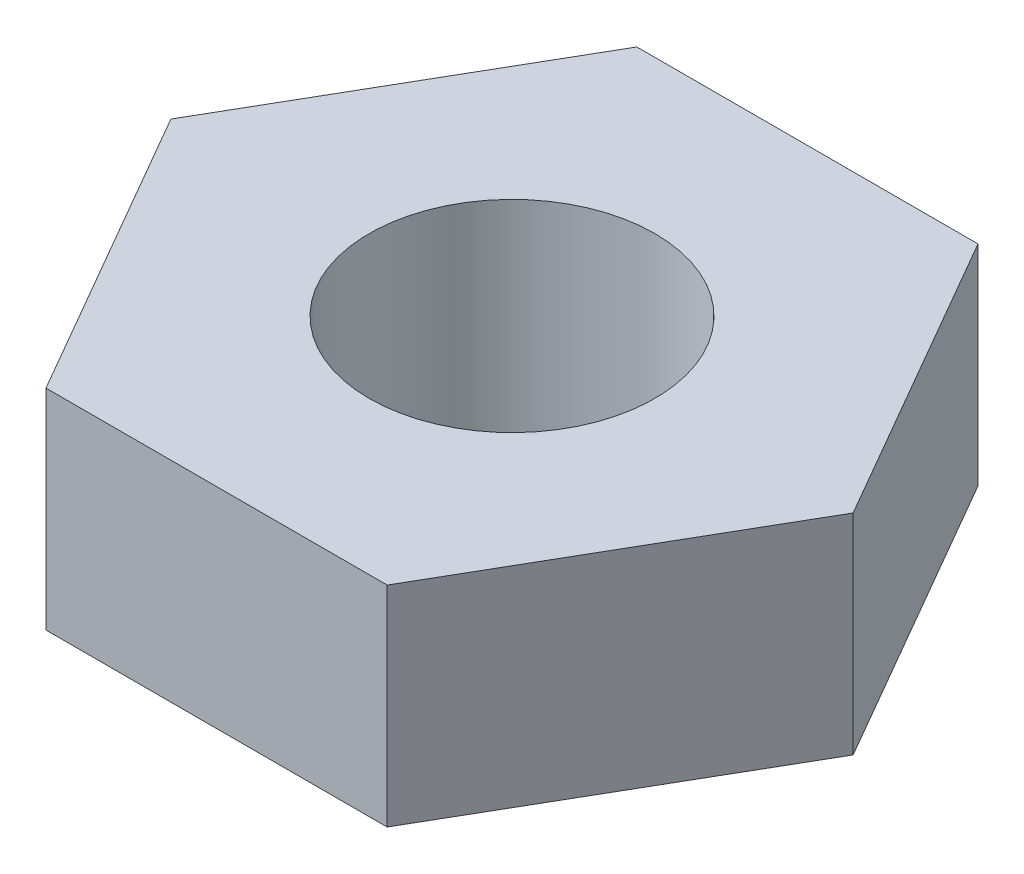
ISO-10303-21;
HEADER;
FILE_DESCRIPTION(('STEP AP214'),'2;1');
FILE_NAME('part.step','',(''),(''),'','','');
FILE_SCHEMA(('AUTOMOTIVE_DESIGN { 1 0 10303 214 1 1 1 1 }'));
ENDSEC;
DATA;
#1=APPLICATION_CONTEXT('core data for automotive mechanical design processes');
#2=APPLICATION_PROTOCOL_DEFINITION('international standard','automotive_design',2000,#1);
#3=PRODUCT_CONTEXT('',#1,'mechanical');
#4=PRODUCT('Part','Part','',(#3));
#5=PRODUCT_RELATED_PRODUCT_CATEGORY('part','',(#4));
#6=PRODUCT_DEFINITION_FORMATION('','',#4);
#7=PRODUCT_DEFINITION_CONTEXT('part definition',#1,'design');
#8=PRODUCT_DEFINITION('design','',#6,#7);
#9=PRODUCT_DEFINITION_SHAPE('','',#8);
#10=(LENGTH_UNIT() NAMED_UNIT(*) SI_UNIT(.MILLI.,.METRE.));
#11=(NAMED_UNIT(*) PLANE_ANGLE_UNIT() SI_UNIT($,.RADIAN.));
#12=(NAMED_UNIT(*) SI_UNIT($,.STERADIAN.) SOLID_ANGLE_UNIT());
#13=UNCERTAINTY_MEASURE_WITH_UNIT(LENGTH_MEASURE(1.E-05),#10,'distance_accuracy_value','');
#14=(GEOMETRIC_REPRESENTATION_CONTEXT(3) GLOBAL_UNCERTAINTY_ASSIGNED_CONTEXT((#13)) GLOBAL_UNIT_ASSIGNED_CONTEXT((#10,
#11,#12)) REPRESENTATION_CONTEXT('',''));
#15=CARTESIAN_POINT('',(0.,0.,0.));
#16=DIRECTION('',(0.,0.,1.));
#17=DIRECTION('',(1.,0.,0.));
#18=AXIS2_PLACEMENT_3D('',#15,#16,#17);
#19=CARTESIAN_POINT('',(-3.2042362589755,-3.937,5.5499));
#20=DIRECTION('',(0.,1.,0.));
#21=DIRECTION('',(0.,0.,1.));
#22=AXIS2_PLACEMENT_3D('',#19,#20,#21);
#23=PLANE('',#22);
#24=DIRECTION('',(-0.5,0.,0.866025403784439));
#25=VECTOR('',#24,1.);
#26=CARTESIAN_POINT('',(-3.2042362589755,-3.937,-5.5499));
#27=LINE('',#26,#25);
#28=CARTESIAN_POINT('',(-3.2042362589755,-3.937,-5.5499));
#29=VERTEX_POINT('',#28);
#30=CARTESIAN_POINT('',(-6.40847251795101,-3.937,0.));
#31=VERTEX_POINT('',#30);
#32=EDGE_CURVE('E100',#29,#31,#27,.T.);
#33=ORIENTED_EDGE('',*,*,#32,.F.);
#34=DIRECTION('',(-1.,0.,0.));
#35=VECTOR('',#34,1.);
#36=CARTESIAN_POINT('',(3.20423625897551,-3.937,-5.5499));
#37=LINE('',#36,#35);
#38=CARTESIAN_POINT('',(3.20423625897551,-3.937,-5.5499));
#39=VERTEX_POINT('',#38);
#40=EDGE_CURVE('E107',#39,#29,#37,.T.);
#41=ORIENTED_EDGE('',*,*,#40,.F.);
#42=DIRECTION('',(-0.499999999999999,0.,-0.866025403784439));
#43=VECTOR('',#42,1.);
#44=CARTESIAN_POINT('',(6.40847251795101,-3.937,0.));
#45=LINE('',#44,#43);
#46=CARTESIAN_POINT('',(6.40847251795101,-3.937,0.));
#47=VERTEX_POINT('',#46);
#48=EDGE_CURVE('E112',#47,#39,#45,.T.);
#49=ORIENTED_EDGE('',*,*,#48,.F.);
#50=DIRECTION('',(0.499999999999999,0.,-0.866025403784439));
#51=VECTOR('',#50,1.);
#52=CARTESIAN_POINT('',(3.20423625897551,-3.937,5.5499));
#53=LINE('',#52,#51);
#54=CARTESIAN_POINT('',(3.20423625897551,-3.937,5.5499));
#55=VERTEX_POINT('',#54);
#56=EDGE_CURVE('E84',#55,#47,#53,.T.);
#57=ORIENTED_EDGE('',*,*,#56,.F.);
#58=DIRECTION('',(1.,0.,0.));
#59=VECTOR('',#58,1.);
#60=CARTESIAN_POINT('',(-3.2042362589755,-3.937,5.5499));
#61=LINE('',#60,#59);
#62=CARTESIAN_POINT('',(-3.2042362589755,-3.937,5.5499));
#63=VERTEX_POINT('',#62);
#64=EDGE_CURVE('E67',#63,#55,#61,.T.);
#65=ORIENTED_EDGE('',*,*,#64,.F.);
#66=DIRECTION('',(0.5,0.,0.866025403784439));
#67=VECTOR('',#66,1.);
#68=CARTESIAN_POINT('',(-6.40847251795101,-3.937,0.));
#69=LINE('',#68,#67);
#70=EDGE_CURVE('E72',#31,#63,#69,.T.);
#71=ORIENTED_EDGE('',*,*,#70,.F.);
#72=EDGE_LOOP('',(#33,#41,#49,#57,#65,#71));
#73=FACE_BOUND('',#72,.T.);
#74=CARTESIAN_POINT('',(0.,-3.937,0.));
#75=DIRECTION('',(0.,-1.,0.));
#76=DIRECTION('',(0.,0.,-1.));
#77=AXIS2_PLACEMENT_3D('',#74,#75,#76);
#78=CIRCLE('',#77,2.68351);
#79=CARTESIAN_POINT('',(0.,-3.937,-2.68351));
#80=VERTEX_POINT('',#79);
#81=EDGE_CURVE('E20',#80,#80,#78,.F.);
#82=ORIENTED_EDGE('',*,*,#81,.T.);
#83=EDGE_LOOP('',(#82));
#84=FACE_BOUND('',#83,.T.);
#85=ADVANCED_FACE('F17',(#73,#84),#23,.F.);
#86=CARTESIAN_POINT('',(0.,-3.937,0.));
#87=DIRECTION('',(0.,-1.,0.));
#88=DIRECTION('',(0.,0.,-1.));
#89=AXIS2_PLACEMENT_3D('',#86,#87,#88);
#90=CYLINDRICAL_SURFACE('',#89,2.68351);
#91=ORIENTED_EDGE('',*,*,#81,.F.);
#92=EDGE_LOOP('',(#91));
#93=FACE_BOUND('',#92,.T.);
#94=CARTESIAN_POINT('',(0.,0.,0.));
#95=DIRECTION('',(0.,-1.,0.));
#96=DIRECTION('',(0.,0.,-1.));
#97=AXIS2_PLACEMENT_3D('',#94,#95,#96);
#98=CIRCLE('',#97,2.68351);
#99=CARTESIAN_POINT('',(0.,0.,-2.68351));
#100=VERTEX_POINT('',#99);
#101=EDGE_CURVE('E94',#100,#100,#98,.T.);
#102=ORIENTED_EDGE('',*,*,#101,.F.);
#103=EDGE_LOOP('',(#102));
#104=FACE_BOUND('',#103,.T.);
#105=ADVANCED_FACE('F153',(#93,#104),#90,.F.);
#106=CARTESIAN_POINT('',(-6.40847251795101,-3.937,0.));
#107=DIRECTION('',(-0.866025403784439,0.,0.5));
#108=DIRECTION('',(0.5,0.,0.866025403784439));
#109=AXIS2_PLACEMENT_3D('',#106,#107,#108);
#110=PLANE('',#109);
#111=ORIENTED_EDGE('',*,*,#70,.T.);
#112=DIRECTION('',(0.,1.,0.));
#113=VECTOR('',#112,1.);
#114=CARTESIAN_POINT('',(-3.2042362589755,-3.937,5.5499));
#115=LINE('',#114,#113);
#116=CARTESIAN_POINT('',(-3.2042362589755,0.,5.5499));
#117=VERTEX_POINT('',#116);
#118=EDGE_CURVE('E74',#117,#63,#115,.F.);
#119=ORIENTED_EDGE('',*,*,#118,.F.);
#120=DIRECTION('',(0.500000000000001,0.,0.866025403784438));
#121=VECTOR('',#120,1.);
#122=CARTESIAN_POINT('',(-6.40847251795101,0.,0.));
#123=LINE('',#122,#121);
#124=CARTESIAN_POINT('',(-6.40847251795101,0.,0.));
#125=VERTEX_POINT('',#124);
#126=EDGE_CURVE('E96',#125,#117,#123,.T.);
#127=ORIENTED_EDGE('',*,*,#126,.F.);
#128=DIRECTION('',(0.,1.,0.));
#129=VECTOR('',#128,1.);
#130=CARTESIAN_POINT('',(-6.40847251795101,-3.937,0.));
#131=LINE('',#130,#129);
#132=EDGE_CURVE('E77',#31,#125,#131,.T.);
#133=ORIENTED_EDGE('',*,*,#132,.F.);
#134=EDGE_LOOP('',(#111,#119,#127,#133));
#135=FACE_BOUND('',#134,.T.);
#136=ADVANCED_FACE('F73',(#135),#110,.T.);
#137=CARTESIAN_POINT('',(-3.2042362589755,-3.937,5.5499));
#138=DIRECTION('',(0.,0.,1.));
#139=DIRECTION('',(1.,0.,0.));
#140=AXIS2_PLACEMENT_3D('',#137,#138,#139);
#141=PLANE('',#140);
#142=ORIENTED_EDGE('',*,*,#64,.T.);
#143=DIRECTION('',(0.,1.,0.));
#144=VECTOR('',#143,1.);
#145=CARTESIAN_POINT('',(3.20423625897551,-3.937,5.5499));
#146=LINE('',#145,#144);
#147=CARTESIAN_POINT('',(3.20423625897551,0.,5.5499));
#148=VERTEX_POINT('',#147);
#149=EDGE_CURVE('E86',#148,#55,#146,.F.);
#150=ORIENTED_EDGE('',*,*,#149,.F.);
#151=DIRECTION('',(1.,0.,0.));
#152=VECTOR('',#151,1.);
#153=CARTESIAN_POINT('',(-3.2042362589755,0.,5.5499));
#154=LINE('',#153,#152);
#155=EDGE_CURVE('E90',#117,#148,#154,.T.);
#156=ORIENTED_EDGE('',*,*,#155,.F.);
#157=ORIENTED_EDGE('',*,*,#118,.T.);
#158=EDGE_LOOP('',(#142,#150,#156,#157));
#159=FACE_BOUND('',#158,.T.);
#160=ADVANCED_FACE('F88',(#159),#141,.T.);
#161=CARTESIAN_POINT('',(3.20423625897551,-3.937,5.5499));
#162=DIRECTION('',(0.866025403784439,0.,0.499999999999999));
#163=DIRECTION('',(0.499999999999999,0.,-0.866025403784439));
#164=AXIS2_PLACEMENT_3D('',#161,#162,#163);
#165=PLANE('',#164);
#166=ORIENTED_EDGE('',*,*,#56,.T.);
#167=DIRECTION('',(0.,1.,0.));
#168=VECTOR('',#167,1.);
#169=CARTESIAN_POINT('',(6.40847251795101,-3.937,0.));
#170=LINE('',#169,#168);
#171=CARTESIAN_POINT('',(6.40847251795101,0.,0.));
#172=VERTEX_POINT('',#171);
#173=EDGE_CURVE('E114',#172,#47,#170,.F.);
#174=ORIENTED_EDGE('',*,*,#173,.F.);
#175=DIRECTION('',(0.5,0.,-0.866025403784439));
#176=VECTOR('',#175,1.);
#177=CARTESIAN_POINT('',(3.20423625897551,0.,5.5499));
#178=LINE('',#177,#176);
#179=EDGE_CURVE('E121',#148,#172,#178,.T.);
#180=ORIENTED_EDGE('',*,*,#179,.F.);
#181=ORIENTED_EDGE('',*,*,#149,.T.);
#182=EDGE_LOOP('',(#166,#174,#180,#181));
#183=FACE_BOUND('',#182,.T.);
#184=ADVANCED_FACE('F119',(#183),#165,.T.);
#185=CARTESIAN_POINT('',(6.40847251795101,-3.937,0.));
#186=DIRECTION('',(0.866025403784439,0.,-0.499999999999999));
#187=DIRECTION('',(-0.499999999999999,0.,-0.866025403784439));
#188=AXIS2_PLACEMENT_3D('',#185,#186,#187);
#189=PLANE('',#188);
#190=ORIENTED_EDGE('',*,*,#48,.T.);
#191=DIRECTION('',(0.,1.,0.));
#192=VECTOR('',#191,1.);
#193=CARTESIAN_POINT('',(3.20423625897551,-3.937,-5.5499));
#194=LINE('',#193,#192);
#195=CARTESIAN_POINT('',(3.20423625897551,0.,-5.5499));
#196=VERTEX_POINT('',#195);
#197=EDGE_CURVE('E109',#196,#39,#194,.F.);
#198=ORIENTED_EDGE('',*,*,#197,.F.);
#199=DIRECTION('',(-0.499999999999999,0.,-0.866025403784439));
#200=VECTOR('',#199,1.);
#201=CARTESIAN_POINT('',(6.40847251795101,0.,0.));
#202=LINE('',#201,#200);
#203=EDGE_CURVE('E125',#172,#196,#202,.T.);
#204=ORIENTED_EDGE('',*,*,#203,.F.);
#205=ORIENTED_EDGE('',*,*,#173,.T.);
#206=EDGE_LOOP('',(#190,#198,#204,#205));
#207=FACE_BOUND('',#206,.T.);
#208=ADVANCED_FACE('F134',(#207),#189,.T.);
#209=CARTESIAN_POINT('',(3.20423625897551,-3.937,-5.5499));
#210=DIRECTION('',(0.,0.,-1.));
#211=DIRECTION('',(-1.,0.,0.));
#212=AXIS2_PLACEMENT_3D('',#209,#210,#211);
#213=PLANE('',#212);
#214=ORIENTED_EDGE('',*,*,#40,.T.);
#215=DIRECTION('',(0.,1.,0.));
#216=VECTOR('',#215,1.);
#217=CARTESIAN_POINT('',(-3.2042362589755,-3.937,-5.5499));
#218=LINE('',#217,#216);
#219=CARTESIAN_POINT('',(-3.2042362589755,0.,-5.5499));
#220=VERTEX_POINT('',#219);
#221=EDGE_CURVE('E35',#220,#29,#218,.F.);
#222=ORIENTED_EDGE('',*,*,#221,.F.);
#223=DIRECTION('',(1.,0.,0.));
#224=VECTOR('',#223,1.);
#225=CARTESIAN_POINT('',(-3.2042362589755,0.,-5.5499));
#226=LINE('',#225,#224);
#227=EDGE_CURVE('E26',#196,#220,#226,.F.);
#228=ORIENTED_EDGE('',*,*,#227,.F.);
#229=ORIENTED_EDGE('',*,*,#197,.T.);
#230=EDGE_LOOP('',(#214,#222,#228,#229));
#231=FACE_BOUND('',#230,.T.);
#232=ADVANCED_FACE('F131',(#231),#213,.T.);
#233=CARTESIAN_POINT('',(-3.2042362589755,-3.937,-5.5499));
#234=DIRECTION('',(-0.866025403784439,0.,-0.5));
#235=DIRECTION('',(-0.5,0.,0.866025403784439));
#236=AXIS2_PLACEMENT_3D('',#233,#234,#235);
#237=PLANE('',#236);
#238=ORIENTED_EDGE('',*,*,#32,.T.);
#239=ORIENTED_EDGE('',*,*,#132,.T.);
#240=DIRECTION('',(-0.5,0.,0.866025403784438));
#241=VECTOR('',#240,1.);
#242=CARTESIAN_POINT('',(-3.2042362589755,0.,-5.5499));
#243=LINE('',#242,#241);
#244=EDGE_CURVE('E11',#220,#125,#243,.T.);
#245=ORIENTED_EDGE('',*,*,#244,.F.);
#246=ORIENTED_EDGE('',*,*,#221,.T.);
#247=EDGE_LOOP('',(#238,#239,#245,#246));
#248=FACE_BOUND('',#247,.T.);
#249=ADVANCED_FACE('F135',(#248),#237,.T.);
#250=CARTESIAN_POINT('',(-3.2042362589755,0.,5.5499));
#251=DIRECTION('',(0.,1.,0.));
#252=DIRECTION('',(0.,0.,1.));
#253=AXIS2_PLACEMENT_3D('',#250,#251,#252);
#254=PLANE('',#253);
#255=ORIENTED_EDGE('',*,*,#227,.T.);
#256=ORIENTED_EDGE('',*,*,#244,.T.);
#257=ORIENTED_EDGE('',*,*,#126,.T.);
#258=ORIENTED_EDGE('',*,*,#155,.T.);
#259=ORIENTED_EDGE('',*,*,#179,.T.);
#260=ORIENTED_EDGE('',*,*,#203,.T.);
#261=EDGE_LOOP('',(#255,#256,#257,#258,#259,#260));
#262=FACE_BOUND('',#261,.T.);
#263=ORIENTED_EDGE('',*,*,#101,.T.);
#264=EDGE_LOOP('',(#263));
#265=FACE_BOUND('',#264,.T.);
#266=ADVANCED_FACE('F128',(#262,#265),#254,.T.);
#267=CLOSED_SHELL('',(#85,#105,#136,#160,#184,#208,#232,#249,#266));
#268=MANIFOLD_SOLID_BREP('B1',#267);
#269=ADVANCED_BREP_SHAPE_REPRESENTATION('',(#18,#268),#14);
#270=SHAPE_DEFINITION_REPRESENTATION(#9,#269);
ENDSEC;
END-ISO-10303-21;
